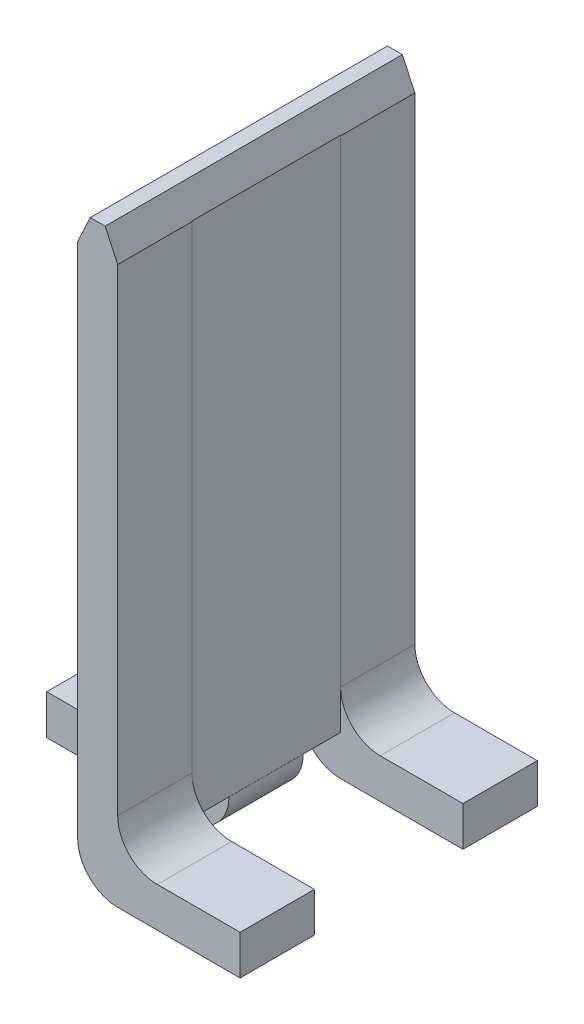
ISO-10303-21;
HEADER;
FILE_DESCRIPTION(('STEP AP214'),'2;1');
FILE_NAME('part.step','',(''),(''),'','','');
FILE_SCHEMA(('AUTOMOTIVE_DESIGN { 1 0 10303 214 1 1 1 1 }'));
ENDSEC;
DATA;
#1=APPLICATION_CONTEXT('core data for automotive mechanical design processes');
#2=APPLICATION_PROTOCOL_DEFINITION('international standard','automotive_design',2000,#1);
#3=PRODUCT_CONTEXT('',#1,'mechanical');
#4=PRODUCT('Part','Part','',(#3));
#5=PRODUCT_RELATED_PRODUCT_CATEGORY('part','',(#4));
#6=PRODUCT_DEFINITION_FORMATION('','',#4);
#7=PRODUCT_DEFINITION_CONTEXT('part definition',#1,'design');
#8=PRODUCT_DEFINITION('design','',#6,#7);
#9=PRODUCT_DEFINITION_SHAPE('','',#8);
#10=(LENGTH_UNIT() NAMED_UNIT(*) SI_UNIT(.MILLI.,.METRE.));
#11=(NAMED_UNIT(*) PLANE_ANGLE_UNIT() SI_UNIT($,.RADIAN.));
#12=(NAMED_UNIT(*) SI_UNIT($,.STERADIAN.) SOLID_ANGLE_UNIT());
#13=UNCERTAINTY_MEASURE_WITH_UNIT(LENGTH_MEASURE(1.E-05),#10,'distance_accuracy_value','');
#14=(GEOMETRIC_REPRESENTATION_CONTEXT(3) GLOBAL_UNCERTAINTY_ASSIGNED_CONTEXT((#13)) GLOBAL_UNIT_ASSIGNED_CONTEXT((#10,
#11,#12)) REPRESENTATION_CONTEXT('',''));
#15=CARTESIAN_POINT('',(0.,0.,0.));
#16=DIRECTION('',(0.,0.,1.));
#17=DIRECTION('',(1.,0.,0.));
#18=AXIS2_PLACEMENT_3D('',#15,#16,#17);
#19=CARTESIAN_POINT('',(1.22321012498064,-4.3598831773422,6.096));
#20=DIRECTION('',(0.,0.,-1.));
#21=DIRECTION('',(-1.,0.,0.));
#22=AXIS2_PLACEMENT_3D('',#19,#20,#21);
#23=CYLINDRICAL_SURFACE('',#22,0.8128);
#24=CARTESIAN_POINT('',(1.22321012498064,-4.3598831773422,4.572));
#25=DIRECTION('',(0.,0.,1.));
#26=DIRECTION('',(1.,0.,0.));
#27=AXIS2_PLACEMENT_3D('',#24,#25,#26);
#28=CIRCLE('',#27,0.8128);
#29=CARTESIAN_POINT('',(1.22321012498064,-5.1726831773422,4.572));
#30=VERTEX_POINT('',#29);
#31=CARTESIAN_POINT('',(0.41041012498064,-4.3598831773422,4.572));
#32=VERTEX_POINT('',#31);
#33=EDGE_CURVE('E11',#30,#32,#28,.F.);
#34=ORIENTED_EDGE('',*,*,#33,.T.);
#35=DIRECTION('',(0.,0.,-1.));
#36=VECTOR('',#35,1.);
#37=CARTESIAN_POINT('',(0.41041012498064,-4.3598831773422,6.096));
#38=LINE('',#37,#36);
#39=CARTESIAN_POINT('',(0.41041012498064,-4.3598831773422,6.096));
#40=VERTEX_POINT('',#39);
#41=EDGE_CURVE('E354',#40,#32,#38,.T.);
#42=ORIENTED_EDGE('',*,*,#41,.F.);
#43=CARTESIAN_POINT('',(1.22321012498064,-4.3598831773422,6.096));
#44=DIRECTION('',(0.,0.,-1.));
#45=DIRECTION('',(1.,0.,0.));
#46=AXIS2_PLACEMENT_3D('',#43,#44,#45);
#47=CIRCLE('',#46,0.8128);
#48=CARTESIAN_POINT('',(1.22321012498064,-5.1726831773422,6.096));
#49=VERTEX_POINT('',#48);
#50=EDGE_CURVE('E278',#49,#40,#47,.T.);
#51=ORIENTED_EDGE('',*,*,#50,.F.);
#52=DIRECTION('',(0.,0.,-1.));
#53=VECTOR('',#52,1.);
#54=CARTESIAN_POINT('',(1.22321012498064,-5.1726831773422,6.096));
#55=LINE('',#54,#53);
#56=EDGE_CURVE('E359',#49,#30,#55,.T.);
#57=ORIENTED_EDGE('',*,*,#56,.T.);
#58=EDGE_LOOP('',(#34,#42,#51,#57));
#59=FACE_BOUND('',#58,.T.);
#60=ADVANCED_FACE('F39',(#59),#23,.F.);
#61=CARTESIAN_POINT('',(0.41041012498064,-4.3598831773422,6.096));
#62=DIRECTION('',(-1.,0.,0.));
#63=DIRECTION('',(0.,-1.,0.));
#64=AXIS2_PLACEMENT_3D('',#61,#62,#63);
#65=PLANE('',#64);
#66=ORIENTED_EDGE('',*,*,#41,.T.);
#67=DIRECTION('',(0.,1.,0.));
#68=VECTOR('',#67,1.);
#69=CARTESIAN_POINT('',(0.41041012498064,-4.3598831773422,4.572));
#70=LINE('',#69,#68);
#71=CARTESIAN_POINT('',(0.410410124980648,5.43220550141747,4.572));
#72=VERTEX_POINT('',#71);
#73=EDGE_CURVE('E489',#32,#72,#70,.T.);
#74=ORIENTED_EDGE('',*,*,#73,.T.);
#75=DIRECTION('',(0.,0.,-1.));
#76=VECTOR('',#75,1.);
#77=CARTESIAN_POINT('',(0.410410124980649,5.43220550141747,6.096));
#78=LINE('',#77,#76);
#79=CARTESIAN_POINT('',(0.410410124980649,5.43220550141747,6.096));
#80=VERTEX_POINT('',#79);
#81=EDGE_CURVE('E349',#80,#72,#78,.T.);
#82=ORIENTED_EDGE('',*,*,#81,.F.);
#83=DIRECTION('',(0.,1.,0.));
#84=VECTOR('',#83,1.);
#85=CARTESIAN_POINT('',(0.41041012498064,-4.3598831773422,6.096));
#86=LINE('',#85,#84);
#87=EDGE_CURVE('E281',#40,#80,#86,.T.);
#88=ORIENTED_EDGE('',*,*,#87,.F.);
#89=EDGE_LOOP('',(#66,#74,#82,#88));
#90=FACE_BOUND('',#89,.T.);
#91=ADVANCED_FACE('F511',(#90),#65,.F.);
#92=CARTESIAN_POINT('',(0.410410124980649,-5.16466008051075,6.096));
#93=DIRECTION('',(0.,0.,-1.));
#94=DIRECTION('',(-1.,0.,0.));
#95=AXIS2_PLACEMENT_3D('',#92,#93,#94);
#96=CYLINDRICAL_SURFACE('',#95,0.820832901389818);
#97=DIRECTION('',(0.,0.,-1.));
#98=VECTOR('',#97,1.);
#99=CARTESIAN_POINT('',(-0.410410124980643,-5.16921741059723,6.096));
#100=LINE('',#99,#98);
#101=CARTESIAN_POINT('',(-0.410410124980643,-5.16921741059723,6.096));
#102=VERTEX_POINT('',#101);
#103=CARTESIAN_POINT('',(-0.410410124980643,-5.16921741059723,4.572));
#104=VERTEX_POINT('',#103);
#105=EDGE_CURVE('E332',#102,#104,#100,.T.);
#106=ORIENTED_EDGE('',*,*,#105,.T.);
#107=CARTESIAN_POINT('',(0.410410124980649,-5.16466008051075,4.572));
#108=DIRECTION('',(0.,0.,1.));
#109=DIRECTION('',(1.,0.,0.));
#110=AXIS2_PLACEMENT_3D('',#107,#108,#109);
#111=CIRCLE('',#110,0.820832901389818);
#112=CARTESIAN_POINT('',(0.406398178813815,-5.9854831773422,4.572));
#113=VERTEX_POINT('',#112);
#114=EDGE_CURVE('E234',#104,#113,#111,.T.);
#115=ORIENTED_EDGE('',*,*,#114,.T.);
#116=DIRECTION('',(0.,0.,-1.));
#117=VECTOR('',#116,1.);
#118=CARTESIAN_POINT('',(0.406398178813815,-5.9854831773422,6.096));
#119=LINE('',#118,#117);
#120=CARTESIAN_POINT('',(0.406398178813815,-5.9854831773422,6.096));
#121=VERTEX_POINT('',#120);
#122=EDGE_CURVE('E374',#121,#113,#119,.T.);
#123=ORIENTED_EDGE('',*,*,#122,.F.);
#124=CARTESIAN_POINT('',(0.410410124980649,-5.16466008051075,6.096));
#125=DIRECTION('',(0.,0.,1.));
#126=DIRECTION('',(1.,0.,0.));
#127=AXIS2_PLACEMENT_3D('',#124,#125,#126);
#128=CIRCLE('',#127,0.820832901389818);
#129=EDGE_CURVE('E264',#102,#121,#128,.T.);
#130=ORIENTED_EDGE('',*,*,#129,.F.);
#131=EDGE_LOOP('',(#106,#115,#123,#130));
#132=FACE_BOUND('',#131,.T.);
#133=ADVANCED_FACE('F531',(#132),#96,.T.);
#134=CARTESIAN_POINT('',(0.406398178813815,-5.9854831773422,6.096));
#135=DIRECTION('',(0.,1.,0.));
#136=DIRECTION('',(-1.,0.,0.));
#137=AXIS2_PLACEMENT_3D('',#134,#135,#136);
#138=PLANE('',#137);
#139=ORIENTED_EDGE('',*,*,#122,.T.);
#140=DIRECTION('',(-1.,0.,0.));
#141=VECTOR('',#140,1.);
#142=CARTESIAN_POINT('',(2.92100000000001,-5.9854831773422,4.572));
#143=LINE('',#142,#141);
#144=CARTESIAN_POINT('',(2.92100000000001,-5.9854831773422,4.572));
#145=VERTEX_POINT('',#144);
#146=EDGE_CURVE('E253',#145,#113,#143,.T.);
#147=ORIENTED_EDGE('',*,*,#146,.F.);
#148=DIRECTION('',(0.,0.,-1.));
#149=VECTOR('',#148,1.);
#150=CARTESIAN_POINT('',(2.921,-5.9854831773422,6.096));
#151=LINE('',#150,#149);
#152=CARTESIAN_POINT('',(2.921,-5.9854831773422,6.096));
#153=VERTEX_POINT('',#152);
#154=EDGE_CURVE('E369',#153,#145,#151,.T.);
#155=ORIENTED_EDGE('',*,*,#154,.F.);
#156=DIRECTION('',(1.,0.,0.));
#157=VECTOR('',#156,1.);
#158=CARTESIAN_POINT('',(0.406398178813815,-5.9854831773422,6.096));
#159=LINE('',#158,#157);
#160=EDGE_CURVE('E268',#121,#153,#159,.T.);
#161=ORIENTED_EDGE('',*,*,#160,.F.);
#162=EDGE_LOOP('',(#139,#147,#155,#161));
#163=FACE_BOUND('',#162,.T.);
#164=ADVANCED_FACE('F527',(#163),#138,.F.);
#165=CARTESIAN_POINT('',(2.921,-5.9854831773422,6.096));
#166=DIRECTION('',(-1.,0.,0.));
#167=DIRECTION('',(0.,0.,1.));
#168=AXIS2_PLACEMENT_3D('',#165,#166,#167);
#169=PLANE('',#168);
#170=ORIENTED_EDGE('',*,*,#154,.T.);
#171=DIRECTION('',(0.,1.,0.));
#172=VECTOR('',#171,1.);
#173=CARTESIAN_POINT('',(2.92100000000001,-5.16921741059723,4.572));
#174=LINE('',#173,#172);
#175=CARTESIAN_POINT('',(2.92100000000001,-5.1726831773422,4.572));
#176=VERTEX_POINT('',#175);
#177=EDGE_CURVE('E244',#145,#176,#174,.T.);
#178=ORIENTED_EDGE('',*,*,#177,.T.);
#179=DIRECTION('',(0.,0.,-1.));
#180=VECTOR('',#179,1.);
#181=CARTESIAN_POINT('',(2.921,-5.1726831773422,6.096));
#182=LINE('',#181,#180);
#183=CARTESIAN_POINT('',(2.921,-5.1726831773422,6.096));
#184=VERTEX_POINT('',#183);
#185=EDGE_CURVE('E364',#184,#176,#182,.T.);
#186=ORIENTED_EDGE('',*,*,#185,.F.);
#187=DIRECTION('',(0.,1.,0.));
#188=VECTOR('',#187,1.);
#189=CARTESIAN_POINT('',(2.921,-5.9854831773422,6.096));
#190=LINE('',#189,#188);
#191=EDGE_CURVE('E272',#153,#184,#190,.T.);
#192=ORIENTED_EDGE('',*,*,#191,.F.);
#193=EDGE_LOOP('',(#170,#178,#186,#192));
#194=FACE_BOUND('',#193,.T.);
#195=ADVANCED_FACE('F523',(#194),#169,.F.);
#196=CARTESIAN_POINT('',(1.22321012498064,-5.1726831773422,6.096));
#197=DIRECTION('',(0.,-1.,0.));
#198=DIRECTION('',(0.,0.,-1.));
#199=AXIS2_PLACEMENT_3D('',#196,#197,#198);
#200=PLANE('',#199);
#201=ORIENTED_EDGE('',*,*,#185,.T.);
#202=DIRECTION('',(-1.,0.,0.));
#203=VECTOR('',#202,1.);
#204=CARTESIAN_POINT('',(1.22321012498064,-5.1726831773422,4.572));
#205=LINE('',#204,#203);
#206=EDGE_CURVE('E257',#176,#30,#205,.T.);
#207=ORIENTED_EDGE('',*,*,#206,.T.);
#208=ORIENTED_EDGE('',*,*,#56,.F.);
#209=DIRECTION('',(-1.,0.,0.));
#210=VECTOR('',#209,1.);
#211=CARTESIAN_POINT('',(1.22321012498064,-5.1726831773422,6.096));
#212=LINE('',#211,#210);
#213=EDGE_CURVE('E275',#184,#49,#212,.T.);
#214=ORIENTED_EDGE('',*,*,#213,.F.);
#215=EDGE_LOOP('',(#201,#207,#208,#214));
#216=FACE_BOUND('',#215,.T.);
#217=ADVANCED_FACE('F518',(#216),#200,.F.);
#218=CARTESIAN_POINT('',(0.406398178813815,-5.9854831773422,1.524));
#219=VERTEX_POINT('',#218);
#220=CARTESIAN_POINT('',(0.406398178813815,-5.9854831773422,0.));
#221=VERTEX_POINT('',#220);
#222=EDGE_CURVE('E373',#219,#221,#119,.T.);
#223=ORIENTED_EDGE('',*,*,#222,.F.);
#224=CARTESIAN_POINT('',(0.410410124980649,-5.16466008051075,1.524));
#225=DIRECTION('',(0.,0.,-1.));
#226=DIRECTION('',(-1.,0.,0.));
#227=AXIS2_PLACEMENT_3D('',#224,#225,#226);
#228=CIRCLE('',#227,0.820832901389818);
#229=CARTESIAN_POINT('',(-0.41041012498064,-5.16921741059723,1.524));
#230=VERTEX_POINT('',#229);
#231=EDGE_CURVE('E252',#219,#230,#228,.T.);
#232=ORIENTED_EDGE('',*,*,#231,.T.);
#233=CARTESIAN_POINT('',(-0.410410124980643,-5.16921741059723,0.));
#234=VERTEX_POINT('',#233);
#235=EDGE_CURVE('E296',#230,#234,#100,.T.);
#236=ORIENTED_EDGE('',*,*,#235,.T.);
#237=CARTESIAN_POINT('',(0.410410124980649,-5.16466008051075,0.));
#238=DIRECTION('',(0.,0.,1.));
#239=DIRECTION('',(1.,0.,0.));
#240=AXIS2_PLACEMENT_3D('',#237,#238,#239);
#241=CIRCLE('',#240,0.820832901389818);
#242=EDGE_CURVE('E263',#234,#221,#241,.T.);
#243=ORIENTED_EDGE('',*,*,#242,.T.);
#244=EDGE_LOOP('',(#223,#232,#236,#243));
#245=FACE_BOUND('',#244,.T.);
#246=ADVANCED_FACE('F41',(#245),#96,.T.);
#247=CARTESIAN_POINT('',(2.92100000000001,-5.9854831773422,1.524));
#248=VERTEX_POINT('',#247);
#249=CARTESIAN_POINT('',(2.921,-5.9854831773422,0.));
#250=VERTEX_POINT('',#249);
#251=EDGE_CURVE('E368',#248,#250,#151,.T.);
#252=ORIENTED_EDGE('',*,*,#251,.F.);
#253=DIRECTION('',(-1.,0.,0.));
#254=VECTOR('',#253,1.);
#255=CARTESIAN_POINT('',(2.92100000000001,-5.9854831773422,1.524));
#256=LINE('',#255,#254);
#257=EDGE_CURVE('E241',#248,#219,#256,.T.);
#258=ORIENTED_EDGE('',*,*,#257,.T.);
#259=ORIENTED_EDGE('',*,*,#222,.T.);
#260=DIRECTION('',(1.,0.,0.));
#261=VECTOR('',#260,1.);
#262=CARTESIAN_POINT('',(0.406398178813815,-5.9854831773422,0.));
#263=LINE('',#262,#261);
#264=EDGE_CURVE('E300',#221,#250,#263,.T.);
#265=ORIENTED_EDGE('',*,*,#264,.T.);
#266=EDGE_LOOP('',(#252,#258,#259,#265));
#267=FACE_BOUND('',#266,.T.);
#268=ADVANCED_FACE('F558',(#267),#138,.F.);
#269=CARTESIAN_POINT('',(2.92100000000001,-5.1726831773422,1.524));
#270=VERTEX_POINT('',#269);
#271=CARTESIAN_POINT('',(2.921,-5.1726831773422,0.));
#272=VERTEX_POINT('',#271);
#273=EDGE_CURVE('E363',#270,#272,#182,.T.);
#274=ORIENTED_EDGE('',*,*,#273,.F.);
#275=DIRECTION('',(0.,-1.,0.));
#276=VECTOR('',#275,1.);
#277=CARTESIAN_POINT('',(2.92100000000001,-5.16921741059723,1.524));
#278=LINE('',#277,#276);
#279=EDGE_CURVE('E237',#270,#248,#278,.T.);
#280=ORIENTED_EDGE('',*,*,#279,.T.);
#281=ORIENTED_EDGE('',*,*,#251,.T.);
#282=DIRECTION('',(0.,1.,0.));
#283=VECTOR('',#282,1.);
#284=CARTESIAN_POINT('',(2.921,-5.9854831773422,0.));
#285=LINE('',#284,#283);
#286=EDGE_CURVE('E304',#250,#272,#285,.T.);
#287=ORIENTED_EDGE('',*,*,#286,.T.);
#288=EDGE_LOOP('',(#274,#280,#281,#287));
#289=FACE_BOUND('',#288,.T.);
#290=ADVANCED_FACE('F557',(#289),#169,.F.);
#291=CARTESIAN_POINT('',(1.22321012498064,-5.1726831773422,1.524));
#292=VERTEX_POINT('',#291);
#293=CARTESIAN_POINT('',(1.22321012498064,-5.1726831773422,0.));
#294=VERTEX_POINT('',#293);
#295=EDGE_CURVE('E358',#292,#294,#55,.T.);
#296=ORIENTED_EDGE('',*,*,#295,.F.);
#297=DIRECTION('',(1.,0.,0.));
#298=VECTOR('',#297,1.);
#299=CARTESIAN_POINT('',(1.22321012498064,-5.1726831773422,1.524));
#300=LINE('',#299,#298);
#301=EDGE_CURVE('E248',#292,#270,#300,.T.);
#302=ORIENTED_EDGE('',*,*,#301,.T.);
#303=ORIENTED_EDGE('',*,*,#273,.T.);
#304=DIRECTION('',(-1.,0.,0.));
#305=VECTOR('',#304,1.);
#306=CARTESIAN_POINT('',(1.22321012498064,-5.1726831773422,0.));
#307=LINE('',#306,#305);
#308=EDGE_CURVE('E308',#272,#294,#307,.T.);
#309=ORIENTED_EDGE('',*,*,#308,.T.);
#310=EDGE_LOOP('',(#296,#302,#303,#309));
#311=FACE_BOUND('',#310,.T.);
#312=ADVANCED_FACE('F386',(#311),#200,.F.);
#313=CARTESIAN_POINT('',(0.41041012498064,-4.3598831773422,1.524));
#314=VERTEX_POINT('',#313);
#315=CARTESIAN_POINT('',(0.41041012498064,-4.3598831773422,0.));
#316=VERTEX_POINT('',#315);
#317=EDGE_CURVE('E353',#314,#316,#38,.T.);
#318=ORIENTED_EDGE('',*,*,#317,.F.);
#319=CARTESIAN_POINT('',(1.22321012498064,-4.3598831773422,1.524));
#320=DIRECTION('',(0.,0.,-1.));
#321=DIRECTION('',(-1.,0.,0.));
#322=AXIS2_PLACEMENT_3D('',#319,#320,#321);
#323=CIRCLE('',#322,0.8128);
#324=EDGE_CURVE('E48',#314,#292,#323,.F.);
#325=ORIENTED_EDGE('',*,*,#324,.T.);
#326=ORIENTED_EDGE('',*,*,#295,.T.);
#327=CARTESIAN_POINT('',(1.22321012498064,-4.3598831773422,0.));
#328=DIRECTION('',(0.,0.,-1.));
#329=DIRECTION('',(1.,0.,0.));
#330=AXIS2_PLACEMENT_3D('',#327,#328,#329);
#331=CIRCLE('',#330,0.8128);
#332=EDGE_CURVE('E312',#294,#316,#331,.T.);
#333=ORIENTED_EDGE('',*,*,#332,.T.);
#334=EDGE_LOOP('',(#318,#325,#326,#333));
#335=FACE_BOUND('',#334,.T.);
#336=ADVANCED_FACE('F382',(#335),#23,.F.);
#337=CARTESIAN_POINT('',(0.410410124980648,5.43220550141747,1.524));
#338=VERTEX_POINT('',#337);
#339=CARTESIAN_POINT('',(0.410410124980649,5.43220550141747,0.));
#340=VERTEX_POINT('',#339);
#341=EDGE_CURVE('E348',#338,#340,#78,.T.);
#342=ORIENTED_EDGE('',*,*,#341,.F.);
#343=DIRECTION('',(0.,-1.,0.));
#344=VECTOR('',#343,1.);
#345=CARTESIAN_POINT('',(0.41041012498064,-4.3598831773422,1.524));
#346=LINE('',#345,#344);
#347=EDGE_CURVE('E496',#338,#314,#346,.T.);
#348=ORIENTED_EDGE('',*,*,#347,.T.);
#349=ORIENTED_EDGE('',*,*,#317,.T.);
#350=DIRECTION('',(0.,1.,0.));
#351=VECTOR('',#350,1.);
#352=CARTESIAN_POINT('',(0.41041012498064,-4.3598831773422,0.));
#353=LINE('',#352,#351);
#354=EDGE_CURVE('E316',#316,#340,#353,.T.);
#355=ORIENTED_EDGE('',*,*,#354,.T.);
#356=EDGE_LOOP('',(#342,#348,#349,#355));
#357=FACE_BOUND('',#356,.T.);
#358=ADVANCED_FACE('F569',(#357),#65,.F.);
#359=CARTESIAN_POINT('',(0.410410124980649,5.43220550141747,6.096));
#360=DIRECTION('',(-0.906307787036649,-0.422618261740701,0.));
#361=DIRECTION('',(0.422618261740701,-0.90630778703665,0.));
#362=AXIS2_PLACEMENT_3D('',#359,#360,#361);
#363=PLANE('',#362);
#364=ORIENTED_EDGE('',*,*,#81,.T.);
#365=DIRECTION('',(-0.422618261740701,0.90630778703665,0.));
#366=VECTOR('',#365,1.);
#367=CARTESIAN_POINT('',(0.410410124980649,5.43220550141747,4.572));
#368=LINE('',#367,#366);
#369=CARTESIAN_POINT('',(0.40639817881381,5.44080914773696,4.572));
#370=VERTEX_POINT('',#369);
#371=EDGE_CURVE('E493',#72,#370,#368,.T.);
#372=ORIENTED_EDGE('',*,*,#371,.T.);
#373=DIRECTION('',(0.,0.,-1.));
#374=VECTOR('',#373,1.);
#375=CARTESIAN_POINT('',(0.40639817881381,5.44080914773696,6.096));
#376=LINE('',#375,#374);
#377=CARTESIAN_POINT('',(0.40639817881381,5.44080914773696,1.524));
#378=VERTEX_POINT('',#377);
#379=EDGE_CURVE('E214',#370,#378,#376,.T.);
#380=ORIENTED_EDGE('',*,*,#379,.T.);
#381=DIRECTION('',(0.422618261740701,-0.90630778703665,0.));
#382=VECTOR('',#381,1.);
#383=CARTESIAN_POINT('',(0.410410124980649,5.43220550141747,1.524));
#384=LINE('',#383,#382);
#385=EDGE_CURVE('E219',#378,#338,#384,.T.);
#386=ORIENTED_EDGE('',*,*,#385,.T.);
#387=ORIENTED_EDGE('',*,*,#341,.T.);
#388=DIRECTION('',(-0.422618261740701,0.906307787036649,0.));
#389=VECTOR('',#388,1.);
#390=CARTESIAN_POINT('',(0.410410124980649,5.43220550141747,0.));
#391=LINE('',#390,#389);
#392=CARTESIAN_POINT('',(0.152400000000001,5.98551,0.));
#393=VERTEX_POINT('',#392);
#394=EDGE_CURVE('E320',#340,#393,#391,.T.);
#395=ORIENTED_EDGE('',*,*,#394,.T.);
#396=DIRECTION('',(0.,0.,-1.));
#397=VECTOR('',#396,1.);
#398=CARTESIAN_POINT('',(0.152400000000001,5.98551,6.096));
#399=LINE('',#398,#397);
#400=CARTESIAN_POINT('',(0.152400000000001,5.98551,6.096));
#401=VERTEX_POINT('',#400);
#402=EDGE_CURVE('E344',#401,#393,#399,.T.);
#403=ORIENTED_EDGE('',*,*,#402,.F.);
#404=DIRECTION('',(-0.422618261740701,0.906307787036649,0.));
#405=VECTOR('',#404,1.);
#406=CARTESIAN_POINT('',(0.410410124980649,5.43220550141747,6.096));
#407=LINE('',#406,#405);
#408=EDGE_CURVE('E284',#80,#401,#407,.T.);
#409=ORIENTED_EDGE('',*,*,#408,.F.);
#410=EDGE_LOOP('',(#364,#372,#380,#386,#387,#395,#403,#409));
#411=FACE_BOUND('',#410,.T.);
#412=ADVANCED_FACE('F505',(#411),#363,.F.);
#413=CARTESIAN_POINT('',(-0.152400000000004,5.98551,6.096));
#414=DIRECTION('',(0.,-1.,0.));
#415=DIRECTION('',(0.,0.,-1.));
#416=AXIS2_PLACEMENT_3D('',#413,#414,#415);
#417=PLANE('',#416);
#418=DIRECTION('',(-1.,0.,0.));
#419=VECTOR('',#418,1.);
#420=CARTESIAN_POINT('',(-0.152400000000004,5.98551,0.));
#421=LINE('',#420,#419);
#422=CARTESIAN_POINT('',(-0.152400000000004,5.98551,0.));
#423=VERTEX_POINT('',#422);
#424=EDGE_CURVE('E323',#393,#423,#421,.T.);
#425=ORIENTED_EDGE('',*,*,#424,.T.);
#426=DIRECTION('',(0.,0.,-1.));
#427=VECTOR('',#426,1.);
#428=CARTESIAN_POINT('',(-0.152400000000004,5.98551,6.096));
#429=LINE('',#428,#427);
#430=CARTESIAN_POINT('',(-0.152400000000004,5.98551,6.096));
#431=VERTEX_POINT('',#430);
#432=EDGE_CURVE('E340',#431,#423,#429,.T.);
#433=ORIENTED_EDGE('',*,*,#432,.F.);
#434=DIRECTION('',(-1.,0.,0.));
#435=VECTOR('',#434,1.);
#436=CARTESIAN_POINT('',(-0.152400000000004,5.98551,6.096));
#437=LINE('',#436,#435);
#438=EDGE_CURVE('E287',#401,#431,#437,.T.);
#439=ORIENTED_EDGE('',*,*,#438,.F.);
#440=ORIENTED_EDGE('',*,*,#402,.T.);
#441=EDGE_LOOP('',(#425,#433,#439,#440));
#442=FACE_BOUND('',#441,.T.);
#443=ADVANCED_FACE('F573',(#442),#417,.F.);
#444=CARTESIAN_POINT('',(-0.410410124980643,5.43220550141747,6.096));
#445=DIRECTION('',(0.906307787036655,-0.422618261740688,0.));
#446=DIRECTION('',(0.422618261740689,0.906307787036655,0.));
#447=AXIS2_PLACEMENT_3D('',#444,#445,#446);
#448=PLANE('',#447);
#449=DIRECTION('',(-0.422618261740689,-0.906307787036655,0.));
#450=VECTOR('',#449,1.);
#451=CARTESIAN_POINT('',(-0.410410124980643,5.43220550141747,0.));
#452=LINE('',#451,#450);
#453=CARTESIAN_POINT('',(-0.410410124980643,5.43220550141747,0.));
#454=VERTEX_POINT('',#453);
#455=EDGE_CURVE('E326',#423,#454,#452,.T.);
#456=ORIENTED_EDGE('',*,*,#455,.T.);
#457=DIRECTION('',(0.,0.,-1.));
#458=VECTOR('',#457,1.);
#459=CARTESIAN_POINT('',(-0.410410124980643,5.43220550141747,6.096));
#460=LINE('',#459,#458);
#461=CARTESIAN_POINT('',(-0.410410124980643,5.43220550141747,6.096));
#462=VERTEX_POINT('',#461);
#463=EDGE_CURVE('E336',#462,#454,#460,.T.);
#464=ORIENTED_EDGE('',*,*,#463,.F.);
#465=DIRECTION('',(-0.422618261740689,-0.906307787036655,0.));
#466=VECTOR('',#465,1.);
#467=CARTESIAN_POINT('',(-0.410410124980643,5.43220550141747,6.096));
#468=LINE('',#467,#466);
#469=EDGE_CURVE('E290',#431,#462,#468,.T.);
#470=ORIENTED_EDGE('',*,*,#469,.F.);
#471=ORIENTED_EDGE('',*,*,#432,.T.);
#472=EDGE_LOOP('',(#456,#464,#470,#471));
#473=FACE_BOUND('',#472,.T.);
#474=ADVANCED_FACE('F578',(#473),#448,.F.);
#475=CARTESIAN_POINT('',(-0.410410124980643,-5.16921741059723,6.096));
#476=DIRECTION('',(1.,0.,0.));
#477=DIRECTION('',(0.,0.,-1.));
#478=AXIS2_PLACEMENT_3D('',#475,#476,#477);
#479=PLANE('',#478);
#480=DIRECTION('',(0.,-1.,0.));
#481=VECTOR('',#480,1.);
#482=CARTESIAN_POINT('',(-0.410410124980643,-5.16921741059723,0.));
#483=LINE('',#482,#481);
#484=EDGE_CURVE('E269',#454,#234,#483,.T.);
#485=ORIENTED_EDGE('',*,*,#484,.T.);
#486=ORIENTED_EDGE('',*,*,#235,.F.);
#487=DIRECTION('',(0.,0.,-1.));
#488=VECTOR('',#487,1.);
#489=CARTESIAN_POINT('',(-0.41041012498064,-5.16921741059723,1.524));
#490=LINE('',#489,#488);
#491=CARTESIAN_POINT('',(-0.41041012498064,-5.16921741059723,2.286));
#492=VERTEX_POINT('',#491);
#493=EDGE_CURVE('E405',#492,#230,#490,.T.);
#494=ORIENTED_EDGE('',*,*,#493,.F.);
#495=DIRECTION('',(-2.2552117513874E-06,0.999999999997457,0.));
#496=VECTOR('',#495,1.);
#497=CARTESIAN_POINT('',(-0.410410124980643,-5.16921741059723,2.286));
#498=LINE('',#497,#496);
#499=CARTESIAN_POINT('',(-0.41041195412793,-4.3581417825074,2.286));
#500=VERTEX_POINT('',#499);
#501=EDGE_CURVE('E431',#492,#500,#498,.T.);
#502=ORIENTED_EDGE('',*,*,#501,.T.);
#503=DIRECTION('',(0.,0.,1.));
#504=VECTOR('',#503,1.);
#505=CARTESIAN_POINT('',(-0.41041195412793,-4.3581417825074,2.286));
#506=LINE('',#505,#504);
#507=CARTESIAN_POINT('',(-0.41041195412793,-4.3581417825074,3.81));
#508=VERTEX_POINT('',#507);
#509=EDGE_CURVE('E410',#500,#508,#506,.T.);
#510=ORIENTED_EDGE('',*,*,#509,.T.);
#511=DIRECTION('',(-2.2552117513874E-06,0.999999999997457,0.));
#512=VECTOR('',#511,1.);
#513=CARTESIAN_POINT('',(-0.410410124980643,-5.16921741059723,3.81));
#514=LINE('',#513,#512);
#515=CARTESIAN_POINT('',(-0.410410124980643,-5.16921741059723,3.81));
#516=VERTEX_POINT('',#515);
#517=EDGE_CURVE('E444',#516,#508,#514,.T.);
#518=ORIENTED_EDGE('',*,*,#517,.F.);
#519=EDGE_CURVE('E403',#104,#516,#490,.T.);
#520=ORIENTED_EDGE('',*,*,#519,.F.);
#521=ORIENTED_EDGE('',*,*,#105,.F.);
#522=DIRECTION('',(0.,-1.,0.));
#523=VECTOR('',#522,1.);
#524=CARTESIAN_POINT('',(-0.410410124980643,-5.16921741059723,6.096));
#525=LINE('',#524,#523);
#526=EDGE_CURVE('E293',#462,#102,#525,.T.);
#527=ORIENTED_EDGE('',*,*,#526,.F.);
#528=ORIENTED_EDGE('',*,*,#463,.T.);
#529=EDGE_LOOP('',(#485,#486,#494,#502,#510,#518,#520,#521,#527,#528));
#530=FACE_BOUND('',#529,.T.);
#531=ADVANCED_FACE('F535',(#530),#479,.F.);
#532=CARTESIAN_POINT('',(0.410410124980649,-5.16466008051075,6.096));
#533=DIRECTION('',(0.,0.,1.));
#534=DIRECTION('',(1.,0.,0.));
#535=AXIS2_PLACEMENT_3D('',#532,#533,#534);
#536=PLANE('',#535);
#537=ORIENTED_EDGE('',*,*,#129,.T.);
#538=ORIENTED_EDGE('',*,*,#160,.T.);
#539=ORIENTED_EDGE('',*,*,#191,.T.);
#540=ORIENTED_EDGE('',*,*,#213,.T.);
#541=ORIENTED_EDGE('',*,*,#50,.T.);
#542=ORIENTED_EDGE('',*,*,#87,.T.);
#543=ORIENTED_EDGE('',*,*,#408,.T.);
#544=ORIENTED_EDGE('',*,*,#438,.T.);
#545=ORIENTED_EDGE('',*,*,#469,.T.);
#546=ORIENTED_EDGE('',*,*,#526,.T.);
#547=EDGE_LOOP('',(#537,#538,#539,#540,#541,#542,#543,#544,#545,#546));
#548=FACE_BOUND('',#547,.T.);
#549=ADVANCED_FACE('F581',(#548),#536,.T.);
#550=CARTESIAN_POINT('',(0.410410124980649,-5.16466008051075,0.));
#551=DIRECTION('',(0.,0.,1.));
#552=DIRECTION('',(1.,0.,0.));
#553=AXIS2_PLACEMENT_3D('',#550,#551,#552);
#554=PLANE('',#553);
#555=ORIENTED_EDGE('',*,*,#242,.F.);
#556=ORIENTED_EDGE('',*,*,#484,.F.);
#557=ORIENTED_EDGE('',*,*,#455,.F.);
#558=ORIENTED_EDGE('',*,*,#424,.F.);
#559=ORIENTED_EDGE('',*,*,#394,.F.);
#560=ORIENTED_EDGE('',*,*,#354,.F.);
#561=ORIENTED_EDGE('',*,*,#332,.F.);
#562=ORIENTED_EDGE('',*,*,#308,.F.);
#563=ORIENTED_EDGE('',*,*,#286,.F.);
#564=ORIENTED_EDGE('',*,*,#264,.F.);
#565=EDGE_LOOP('',(#555,#556,#557,#558,#559,#560,#561,#562,#563,#564));
#566=FACE_BOUND('',#565,.T.);
#567=ADVANCED_FACE('F564',(#566),#554,.F.);
#568=CARTESIAN_POINT('',(2.92100000000001,-5.16921741059723,4.572));
#569=DIRECTION('',(0.,0.,1.));
#570=DIRECTION('',(1.,0.,0.));
#571=AXIS2_PLACEMENT_3D('',#568,#569,#570);
#572=PLANE('',#571);
#573=DIRECTION('',(-1.,0.,0.));
#574=VECTOR('',#573,1.);
#575=CARTESIAN_POINT('',(2.92100000000001,-5.16921741059723,4.572));
#576=LINE('',#575,#574);
#577=CARTESIAN_POINT('',(0.406398178813814,-5.16921741059723,4.572));
#578=VERTEX_POINT('',#577);
#579=EDGE_CURVE('E226',#578,#104,#576,.T.);
#580=ORIENTED_EDGE('',*,*,#579,.F.);
#581=DIRECTION('',(0.,-1.,0.));
#582=VECTOR('',#581,1.);
#583=CARTESIAN_POINT('',(0.40639817881381,5.98551,4.572));
#584=LINE('',#583,#582);
#585=EDGE_CURVE('E211',#370,#578,#584,.T.);
#586=ORIENTED_EDGE('',*,*,#585,.F.);
#587=ORIENTED_EDGE('',*,*,#371,.F.);
#588=ORIENTED_EDGE('',*,*,#73,.F.);
#589=ORIENTED_EDGE('',*,*,#33,.F.);
#590=ORIENTED_EDGE('',*,*,#206,.F.);
#591=ORIENTED_EDGE('',*,*,#177,.F.);
#592=ORIENTED_EDGE('',*,*,#146,.T.);
#593=ORIENTED_EDGE('',*,*,#114,.F.);
#594=EDGE_LOOP('',(#580,#586,#587,#588,#589,#590,#591,#592,#593));
#595=FACE_BOUND('',#594,.T.);
#596=ADVANCED_FACE('F232',(#595),#572,.F.);
#597=CARTESIAN_POINT('',(2.92100000000001,-5.16921741059723,1.524));
#598=DIRECTION('',(0.,0.,-1.));
#599=DIRECTION('',(-1.,0.,0.));
#600=AXIS2_PLACEMENT_3D('',#597,#598,#599);
#601=PLANE('',#600);
#602=ORIENTED_EDGE('',*,*,#257,.F.);
#603=ORIENTED_EDGE('',*,*,#279,.F.);
#604=ORIENTED_EDGE('',*,*,#301,.F.);
#605=ORIENTED_EDGE('',*,*,#324,.F.);
#606=ORIENTED_EDGE('',*,*,#347,.F.);
#607=ORIENTED_EDGE('',*,*,#385,.F.);
#608=DIRECTION('',(0.,-1.,0.));
#609=VECTOR('',#608,1.);
#610=CARTESIAN_POINT('',(0.40639817881381,5.98551,1.524));
#611=LINE('',#610,#609);
#612=CARTESIAN_POINT('',(0.40639817881381,-5.16921741059723,1.524));
#613=VERTEX_POINT('',#612);
#614=EDGE_CURVE('E220',#378,#613,#611,.T.);
#615=ORIENTED_EDGE('',*,*,#614,.T.);
#616=DIRECTION('',(-1.,0.,0.));
#617=VECTOR('',#616,1.);
#618=CARTESIAN_POINT('',(2.92100000000001,-5.16921741059723,1.524));
#619=LINE('',#618,#617);
#620=EDGE_CURVE('E229',#613,#230,#619,.T.);
#621=ORIENTED_EDGE('',*,*,#620,.T.);
#622=ORIENTED_EDGE('',*,*,#231,.F.);
#623=EDGE_LOOP('',(#602,#603,#604,#605,#606,#607,#615,#621,#622));
#624=FACE_BOUND('',#623,.T.);
#625=ADVANCED_FACE('F503',(#624),#601,.F.);
#626=CARTESIAN_POINT('',(2.92100000000001,-5.16921741059723,1.524));
#627=DIRECTION('',(0.,1.,0.));
#628=DIRECTION('',(-1.,0.,0.));
#629=AXIS2_PLACEMENT_3D('',#626,#627,#628);
#630=PLANE('',#629);
#631=ORIENTED_EDGE('',*,*,#620,.F.);
#632=DIRECTION('',(0.,0.,-1.));
#633=VECTOR('',#632,1.);
#634=CARTESIAN_POINT('',(0.406398178813814,-5.16921741059723,4.572));
#635=LINE('',#634,#633);
#636=EDGE_CURVE('E55',#578,#613,#635,.T.);
#637=ORIENTED_EDGE('',*,*,#636,.F.);
#638=ORIENTED_EDGE('',*,*,#579,.T.);
#639=ORIENTED_EDGE('',*,*,#519,.T.);
#640=DIRECTION('',(0.,0.,1.));
#641=VECTOR('',#640,1.);
#642=CARTESIAN_POINT('',(-0.410410124980643,-5.16921741059723,2.286));
#643=LINE('',#642,#641);
#644=EDGE_CURVE('E424',#492,#516,#643,.T.);
#645=ORIENTED_EDGE('',*,*,#644,.F.);
#646=ORIENTED_EDGE('',*,*,#493,.T.);
#647=EDGE_LOOP('',(#631,#637,#638,#639,#645,#646));
#648=FACE_BOUND('',#647,.T.);
#649=ADVANCED_FACE('F224',(#648),#630,.F.);
#650=CARTESIAN_POINT('',(0.40585380481758,-5.1709491352028,2.286));
#651=DIRECTION('',(0.00212152055876681,0.999997749572727,0.));
#652=DIRECTION('',(-0.999997749572727,0.00212152055876681,0.));
#653=AXIS2_PLACEMENT_3D('',#650,#651,#652);
#654=PLANE('',#653);
#655=DIRECTION('',(-0.999997749572727,0.00212152055876681,0.));
#656=VECTOR('',#655,1.);
#657=CARTESIAN_POINT('',(0.40585380481758,-5.1709491352028,3.81));
#658=LINE('',#657,#656);
#659=CARTESIAN_POINT('',(0.40585380481758,-5.1709491352028,3.81));
#660=VERTEX_POINT('',#659);
#661=EDGE_CURVE('E427',#660,#516,#658,.T.);
#662=ORIENTED_EDGE('',*,*,#661,.F.);
#663=DIRECTION('',(0.,0.,1.));
#664=VECTOR('',#663,1.);
#665=CARTESIAN_POINT('',(0.40585380481758,-5.1709491352028,2.286));
#666=LINE('',#665,#664);
#667=CARTESIAN_POINT('',(0.40585380481758,-5.1709491352028,2.286));
#668=VERTEX_POINT('',#667);
#669=EDGE_CURVE('E421',#668,#660,#666,.T.);
#670=ORIENTED_EDGE('',*,*,#669,.F.);
#671=DIRECTION('',(-0.999997749572727,0.00212152055876681,0.));
#672=VECTOR('',#671,1.);
#673=CARTESIAN_POINT('',(0.40585380481758,-5.1709491352028,2.286));
#674=LINE('',#673,#672);
#675=EDGE_CURVE('E63',#668,#492,#674,.T.);
#676=ORIENTED_EDGE('',*,*,#675,.T.);
#677=ORIENTED_EDGE('',*,*,#644,.T.);
#678=EDGE_LOOP('',(#662,#670,#676,#677));
#679=FACE_BOUND('',#678,.T.);
#680=ADVANCED_FACE('F540',(#679),#654,.T.);
#681=CARTESIAN_POINT('',(-0.410410124980643,-5.16921741059723,2.286));
#682=DIRECTION('',(0.,0.,1.));
#683=DIRECTION('',(1.,0.,0.));
#684=AXIS2_PLACEMENT_3D('',#681,#682,#683);
#685=CYLINDRICAL_SURFACE('',#684,0.816265766744966);
#686=CARTESIAN_POINT('',(-0.410410124980643,-5.16921741059723,3.81));
#687=DIRECTION('',(0.,0.,1.));
#688=DIRECTION('',(1.,0.,0.));
#689=AXIS2_PLACEMENT_3D('',#686,#687,#688);
#690=CIRCLE('',#689,0.816265766744966);
#691=CARTESIAN_POINT('',(-0.410410124980641,-5.9854831773422,3.81));
#692=VERTEX_POINT('',#691);
#693=EDGE_CURVE('E432',#692,#660,#690,.T.);
#694=ORIENTED_EDGE('',*,*,#693,.F.);
#695=DIRECTION('',(0.,0.,1.));
#696=VECTOR('',#695,1.);
#697=CARTESIAN_POINT('',(-0.410410124980641,-5.9854831773422,2.286));
#698=LINE('',#697,#696);
#699=CARTESIAN_POINT('',(-0.410410124980641,-5.9854831773422,2.286));
#700=VERTEX_POINT('',#699);
#701=EDGE_CURVE('E418',#700,#692,#698,.T.);
#702=ORIENTED_EDGE('',*,*,#701,.F.);
#703=CARTESIAN_POINT('',(-0.410410124980643,-5.16921741059723,2.286));
#704=DIRECTION('',(0.,0.,1.));
#705=DIRECTION('',(1.,0.,0.));
#706=AXIS2_PLACEMENT_3D('',#703,#704,#705);
#707=CIRCLE('',#706,0.816265766744966);
#708=EDGE_CURVE('E451',#700,#668,#707,.T.);
#709=ORIENTED_EDGE('',*,*,#708,.T.);
#710=ORIENTED_EDGE('',*,*,#669,.T.);
#711=EDGE_LOOP('',(#694,#702,#709,#710));
#712=FACE_BOUND('',#711,.T.);
#713=ADVANCED_FACE('F546',(#712),#685,.T.);
#714=CARTESIAN_POINT('',(-1.22321012498064,-5.9854831773422,2.286));
#715=DIRECTION('',(0.,-1.,0.));
#716=DIRECTION('',(0.,0.,-1.));
#717=AXIS2_PLACEMENT_3D('',#714,#715,#716);
#718=PLANE('',#717);
#719=DIRECTION('',(1.,0.,0.));
#720=VECTOR('',#719,1.);
#721=CARTESIAN_POINT('',(-1.22321012498064,-5.9854831773422,3.81));
#722=LINE('',#721,#720);
#723=CARTESIAN_POINT('',(-3.33141012498064,-5.9854831773422,3.81));
#724=VERTEX_POINT('',#723);
#725=EDGE_CURVE('E436',#724,#692,#722,.T.);
#726=ORIENTED_EDGE('',*,*,#725,.F.);
#727=DIRECTION('',(0.,0.,1.));
#728=VECTOR('',#727,1.);
#729=CARTESIAN_POINT('',(-3.33141012498064,-5.9854831773422,2.286));
#730=LINE('',#729,#728);
#731=CARTESIAN_POINT('',(-3.33141012498064,-5.9854831773422,2.286));
#732=VERTEX_POINT('',#731);
#733=EDGE_CURVE('E472',#732,#724,#730,.T.);
#734=ORIENTED_EDGE('',*,*,#733,.F.);
#735=DIRECTION('',(1.,0.,0.));
#736=VECTOR('',#735,1.);
#737=CARTESIAN_POINT('',(-1.22321012498064,-5.9854831773422,2.286));
#738=LINE('',#737,#736);
#739=EDGE_CURVE('E455',#732,#700,#738,.T.);
#740=ORIENTED_EDGE('',*,*,#739,.T.);
#741=ORIENTED_EDGE('',*,*,#701,.T.);
#742=EDGE_LOOP('',(#726,#734,#740,#741));
#743=FACE_BOUND('',#742,.T.);
#744=ADVANCED_FACE('F657',(#743),#718,.T.);
#745=CARTESIAN_POINT('',(-1.22321012498064,-4.35641741059723,2.286));
#746=DIRECTION('',(0.,0.,1.));
#747=DIRECTION('',(1.,0.,0.));
#748=AXIS2_PLACEMENT_3D('',#745,#746,#747);
#749=CYLINDRICAL_SURFACE('',#748,0.8128);
#750=CARTESIAN_POINT('',(-1.22321012498064,-4.35641741059723,3.81));
#751=DIRECTION('',(0.,0.,-1.));
#752=DIRECTION('',(1.,0.,0.));
#753=AXIS2_PLACEMENT_3D('',#750,#751,#752);
#754=CIRCLE('',#753,0.8128);
#755=CARTESIAN_POINT('',(-1.22321012498064,-5.16921741059723,3.81));
#756=VERTEX_POINT('',#755);
#757=EDGE_CURVE('E440',#508,#756,#754,.T.);
#758=ORIENTED_EDGE('',*,*,#757,.F.);
#759=ORIENTED_EDGE('',*,*,#509,.F.);
#760=CARTESIAN_POINT('',(-1.22321012498064,-4.35641741059723,2.286));
#761=DIRECTION('',(0.,0.,-1.));
#762=DIRECTION('',(1.,0.,0.));
#763=AXIS2_PLACEMENT_3D('',#760,#761,#762);
#764=CIRCLE('',#763,0.8128);
#765=CARTESIAN_POINT('',(-1.22321012498064,-5.16921741059723,2.286));
#766=VERTEX_POINT('',#765);
#767=EDGE_CURVE('E459',#500,#766,#764,.T.);
#768=ORIENTED_EDGE('',*,*,#767,.T.);
#769=DIRECTION('',(0.,0.,1.));
#770=VECTOR('',#769,1.);
#771=CARTESIAN_POINT('',(-1.22321012498064,-5.16921741059723,2.286));
#772=LINE('',#771,#770);
#773=EDGE_CURVE('E414',#766,#756,#772,.T.);
#774=ORIENTED_EDGE('',*,*,#773,.T.);
#775=EDGE_LOOP('',(#758,#759,#768,#774));
#776=FACE_BOUND('',#775,.T.);
#777=ADVANCED_FACE('F666',(#776),#749,.F.);
#778=CARTESIAN_POINT('',(-1.22321012498064,-4.35641741059723,2.286));
#779=DIRECTION('',(0.,0.,1.));
#780=DIRECTION('',(1.,0.,0.));
#781=AXIS2_PLACEMENT_3D('',#778,#779,#780);
#782=PLANE('',#781);
#783=ORIENTED_EDGE('',*,*,#708,.F.);
#784=ORIENTED_EDGE('',*,*,#739,.F.);
#785=DIRECTION('',(0.,-1.,0.));
#786=VECTOR('',#785,1.);
#787=CARTESIAN_POINT('',(-3.33141012498064,-5.9854831773422,2.286));
#788=LINE('',#787,#786);
#789=CARTESIAN_POINT('',(-3.33141012498064,-5.16921741059723,2.286));
#790=VERTEX_POINT('',#789);
#791=EDGE_CURVE('E476',#790,#732,#788,.T.);
#792=ORIENTED_EDGE('',*,*,#791,.F.);
#793=DIRECTION('',(1.,0.,0.));
#794=VECTOR('',#793,1.);
#795=CARTESIAN_POINT('',(-3.33141012498064,-5.16921741059723,2.286));
#796=LINE('',#795,#794);
#797=EDGE_CURVE('E468',#790,#766,#796,.T.);
#798=ORIENTED_EDGE('',*,*,#797,.T.);
#799=ORIENTED_EDGE('',*,*,#767,.F.);
#800=ORIENTED_EDGE('',*,*,#501,.F.);
#801=ORIENTED_EDGE('',*,*,#675,.F.);
#802=EDGE_LOOP('',(#783,#784,#792,#798,#799,#800,#801));
#803=FACE_BOUND('',#802,.T.);
#804=ADVANCED_FACE('F549',(#803),#782,.F.);
#805=CARTESIAN_POINT('',(-1.22321012498064,-4.35641741059723,3.81));
#806=DIRECTION('',(0.,0.,1.));
#807=DIRECTION('',(1.,0.,0.));
#808=AXIS2_PLACEMENT_3D('',#805,#806,#807);
#809=PLANE('',#808);
#810=ORIENTED_EDGE('',*,*,#661,.T.);
#811=ORIENTED_EDGE('',*,*,#517,.T.);
#812=ORIENTED_EDGE('',*,*,#757,.T.);
#813=DIRECTION('',(1.,0.,0.));
#814=VECTOR('',#813,1.);
#815=CARTESIAN_POINT('',(-3.33141012498064,-5.16921741059723,3.81));
#816=LINE('',#815,#814);
#817=CARTESIAN_POINT('',(-3.33141012498064,-5.16921741059723,3.81));
#818=VERTEX_POINT('',#817);
#819=EDGE_CURVE('E448',#818,#756,#816,.T.);
#820=ORIENTED_EDGE('',*,*,#819,.F.);
#821=DIRECTION('',(0.,1.,0.));
#822=VECTOR('',#821,1.);
#823=CARTESIAN_POINT('',(-3.33141012498064,-5.9854831773422,3.81));
#824=LINE('',#823,#822);
#825=EDGE_CURVE('E483',#724,#818,#824,.T.);
#826=ORIENTED_EDGE('',*,*,#825,.F.);
#827=ORIENTED_EDGE('',*,*,#725,.T.);
#828=ORIENTED_EDGE('',*,*,#693,.T.);
#829=EDGE_LOOP('',(#810,#811,#812,#820,#826,#827,#828));
#830=FACE_BOUND('',#829,.T.);
#831=ADVANCED_FACE('F542',(#830),#809,.T.);
#832=CARTESIAN_POINT('',(-3.33141012498064,-5.16921741059723,2.286));
#833=DIRECTION('',(0.,-1.,0.));
#834=DIRECTION('',(1.,0.,0.));
#835=AXIS2_PLACEMENT_3D('',#832,#833,#834);
#836=PLANE('',#835);
#837=ORIENTED_EDGE('',*,*,#773,.F.);
#838=ORIENTED_EDGE('',*,*,#797,.F.);
#839=DIRECTION('',(0.,0.,-1.));
#840=VECTOR('',#839,1.);
#841=CARTESIAN_POINT('',(-3.33141012498064,-5.16921741059723,2.286));
#842=LINE('',#841,#840);
#843=EDGE_CURVE('E480',#818,#790,#842,.T.);
#844=ORIENTED_EDGE('',*,*,#843,.F.);
#845=ORIENTED_EDGE('',*,*,#819,.T.);
#846=EDGE_LOOP('',(#837,#838,#844,#845));
#847=FACE_BOUND('',#846,.T.);
#848=ADVANCED_FACE('F695',(#847),#836,.F.);
#849=CARTESIAN_POINT('',(-3.33141012498064,0.,0.));
#850=DIRECTION('',(1.,0.,0.));
#851=DIRECTION('',(0.,1.,0.));
#852=AXIS2_PLACEMENT_3D('',#849,#850,#851);
#853=PLANE('',#852);
#854=ORIENTED_EDGE('',*,*,#825,.T.);
#855=ORIENTED_EDGE('',*,*,#843,.T.);
#856=ORIENTED_EDGE('',*,*,#791,.T.);
#857=ORIENTED_EDGE('',*,*,#733,.T.);
#858=EDGE_LOOP('',(#854,#855,#856,#857));
#859=FACE_BOUND('',#858,.T.);
#860=ADVANCED_FACE('F705',(#859),#853,.F.);
#861=CARTESIAN_POINT('',(0.40639817881381,5.98551,4.572));
#862=DIRECTION('',(-1.,0.,0.));
#863=DIRECTION('',(0.,-1.,0.));
#864=AXIS2_PLACEMENT_3D('',#861,#862,#863);
#865=PLANE('',#864);
#866=ORIENTED_EDGE('',*,*,#585,.T.);
#867=ORIENTED_EDGE('',*,*,#636,.T.);
#868=ORIENTED_EDGE('',*,*,#614,.F.);
#869=ORIENTED_EDGE('',*,*,#379,.F.);
#870=EDGE_LOOP('',(#866,#867,#868,#869));
#871=FACE_BOUND('',#870,.T.);
#872=ADVANCED_FACE('F212',(#871),#865,.F.);
#873=CLOSED_SHELL('',(#60,#91,#133,#164,#195,#217,#246,#268,#290,#312,#336,#358,#412,#443,#474,
#531,#549,#567,#596,#625,#649,#680,#713,#744,#777,#804,#831,#848,#860,#872));
#874=MANIFOLD_SOLID_BREP('B2',#873);
#875=ADVANCED_BREP_SHAPE_REPRESENTATION('',(#18,#874),#14);
#876=SHAPE_DEFINITION_REPRESENTATION(#9,#875);
ENDSEC;
END-ISO-10303-21;
